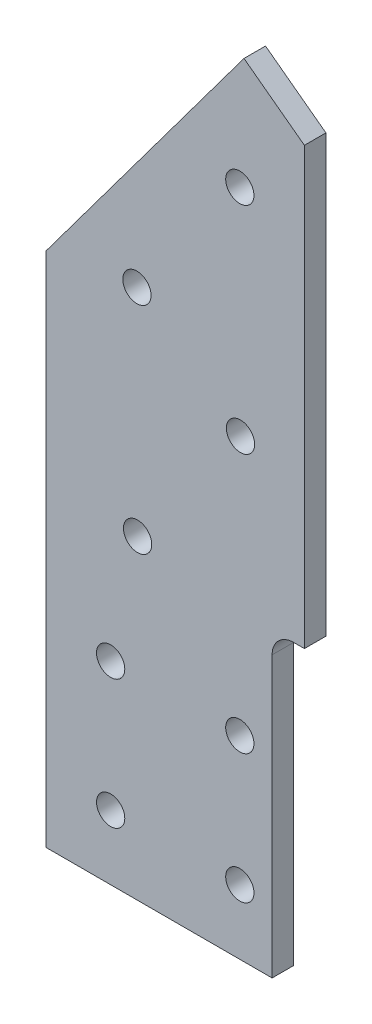
ISO-10303-21;
HEADER;
FILE_DESCRIPTION(('STEP AP214'),'2;1');
FILE_NAME('part.step','',(''),(''),'','','');
FILE_SCHEMA(('AUTOMOTIVE_DESIGN { 1 0 10303 214 1 1 1 1 }'));
ENDSEC;
DATA;
#1=APPLICATION_CONTEXT('core data for automotive mechanical design processes');
#2=APPLICATION_PROTOCOL_DEFINITION('international standard','automotive_design',2000,#1);
#3=PRODUCT_CONTEXT('',#1,'mechanical');
#4=PRODUCT('Part','Part','',(#3));
#5=PRODUCT_RELATED_PRODUCT_CATEGORY('part','',(#4));
#6=PRODUCT_DEFINITION_FORMATION('','',#4);
#7=PRODUCT_DEFINITION_CONTEXT('part definition',#1,'design');
#8=PRODUCT_DEFINITION('design','',#6,#7);
#9=PRODUCT_DEFINITION_SHAPE('','',#8);
#10=(LENGTH_UNIT() NAMED_UNIT(*) SI_UNIT(.MILLI.,.METRE.));
#11=(NAMED_UNIT(*) PLANE_ANGLE_UNIT() SI_UNIT($,.RADIAN.));
#12=(NAMED_UNIT(*) SI_UNIT($,.STERADIAN.) SOLID_ANGLE_UNIT());
#13=UNCERTAINTY_MEASURE_WITH_UNIT(LENGTH_MEASURE(1.E-05),#10,'distance_accuracy_value','');
#14=(GEOMETRIC_REPRESENTATION_CONTEXT(3) GLOBAL_UNCERTAINTY_ASSIGNED_CONTEXT((#13)) GLOBAL_UNIT_ASSIGNED_CONTEXT((#10,
#11,#12)) REPRESENTATION_CONTEXT('',''));
#15=CARTESIAN_POINT('',(0.,0.,0.));
#16=DIRECTION('',(0.,0.,1.));
#17=DIRECTION('',(1.,0.,0.));
#18=AXIS2_PLACEMENT_3D('',#15,#16,#17);
#19=CARTESIAN_POINT('',(0.,0.,0.));
#20=DIRECTION('',(0.,0.,-1.));
#21=DIRECTION('',(-1.,0.,0.));
#22=AXIS2_PLACEMENT_3D('',#19,#20,#21);
#23=PLANE('',#22);
#24=DIRECTION('',(-1.,0.,0.));
#25=VECTOR('',#24,1.);
#26=CARTESIAN_POINT('',(76.2,88.9,0.));
#27=LINE('',#26,#25);
#28=CARTESIAN_POINT('',(76.2,88.9000000000001,0.));
#29=VERTEX_POINT('',#28);
#30=CARTESIAN_POINT('',(73.025,88.9,0.));
#31=VERTEX_POINT('',#30);
#32=EDGE_CURVE('E114',#29,#31,#27,.T.);
#33=ORIENTED_EDGE('',*,*,#32,.T.);
#34=CARTESIAN_POINT('',(73.025,82.55,0.));
#35=DIRECTION('',(0.,0.,-1.));
#36=DIRECTION('',(-1.,0.,0.));
#37=AXIS2_PLACEMENT_3D('',#34,#35,#36);
#38=CIRCLE('',#37,6.35);
#39=CARTESIAN_POINT('',(66.675,82.55,0.));
#40=VERTEX_POINT('',#39);
#41=EDGE_CURVE('E11',#31,#40,#38,.F.);
#42=ORIENTED_EDGE('',*,*,#41,.T.);
#43=DIRECTION('',(0.,-1.,0.));
#44=VECTOR('',#43,1.);
#45=CARTESIAN_POINT('',(66.675,0.,0.));
#46=LINE('',#45,#44);
#47=CARTESIAN_POINT('',(66.675,0.,0.));
#48=VERTEX_POINT('',#47);
#49=EDGE_CURVE('E102',#40,#48,#46,.T.);
#50=ORIENTED_EDGE('',*,*,#49,.T.);
#51=DIRECTION('',(1.,0.,0.));
#52=VECTOR('',#51,1.);
#53=CARTESIAN_POINT('',(0.,0.,0.));
#54=LINE('',#53,#52);
#55=CARTESIAN_POINT('',(0.,0.,0.));
#56=VERTEX_POINT('',#55);
#57=EDGE_CURVE('E107',#56,#48,#54,.T.);
#58=ORIENTED_EDGE('',*,*,#57,.F.);
#59=DIRECTION('',(0.,-1.,0.));
#60=VECTOR('',#59,1.);
#61=CARTESIAN_POINT('',(0.,0.,0.));
#62=LINE('',#61,#60);
#63=CARTESIAN_POINT('',(0.,152.4,0.));
#64=VERTEX_POINT('',#63);
#65=EDGE_CURVE('E129',#64,#56,#62,.T.);
#66=ORIENTED_EDGE('',*,*,#65,.F.);
#67=DIRECTION('',(-0.597485201625335,-0.801879937296559,0.));
#68=VECTOR('',#67,1.);
#69=CARTESIAN_POINT('',(0.,152.4,0.));
#70=LINE('',#69,#68);
#71=CARTESIAN_POINT('',(58.378218393584,230.74892308226,0.));
#72=VERTEX_POINT('',#71);
#73=EDGE_CURVE('E138',#72,#64,#70,.T.);
#74=ORIENTED_EDGE('',*,*,#73,.F.);
#75=DIRECTION('',(-0.801879937296559,0.597485201625334,0.));
#76=VECTOR('',#75,1.);
#77=CARTESIAN_POINT('',(58.378218393584,230.74892308226,0.));
#78=LINE('',#77,#76);
#79=CARTESIAN_POINT('',(76.2,217.469814476137,0.));
#80=VERTEX_POINT('',#79);
#81=EDGE_CURVE('E131',#80,#72,#78,.T.);
#82=ORIENTED_EDGE('',*,*,#81,.F.);
#83=DIRECTION('',(0.,1.,0.));
#84=VECTOR('',#83,1.);
#85=CARTESIAN_POINT('',(76.2,217.469814476137,0.));
#86=LINE('',#85,#84);
#87=EDGE_CURVE('E128',#29,#80,#86,.T.);
#88=ORIENTED_EDGE('',*,*,#87,.F.);
#89=EDGE_LOOP('',(#33,#42,#50,#58,#66,#74,#82,#88));
#90=FACE_BOUND('',#89,.T.);
#91=CARTESIAN_POINT('',(19.05,57.15,0.));
#92=DIRECTION('',(0.,0.,1.));
#93=DIRECTION('',(1.,0.,0.));
#94=AXIS2_PLACEMENT_3D('',#91,#92,#93);
#95=CIRCLE('',#94,4.167251);
#96=CARTESIAN_POINT('',(23.217251,57.15,0.));
#97=VERTEX_POINT('',#96);
#98=EDGE_CURVE('E158',#97,#97,#95,.T.);
#99=ORIENTED_EDGE('',*,*,#98,.T.);
#100=EDGE_LOOP('',(#99));
#101=FACE_BOUND('',#100,.T.);
#102=CARTESIAN_POINT('',(57.15,57.15,0.));
#103=DIRECTION('',(0.,0.,1.));
#104=DIRECTION('',(1.,0.,0.));
#105=AXIS2_PLACEMENT_3D('',#102,#103,#104);
#106=CIRCLE('',#105,4.167251);
#107=CARTESIAN_POINT('',(61.317251,57.15,0.));
#108=VERTEX_POINT('',#107);
#109=EDGE_CURVE('E152',#108,#108,#106,.T.);
#110=ORIENTED_EDGE('',*,*,#109,.T.);
#111=EDGE_LOOP('',(#110));
#112=FACE_BOUND('',#111,.T.);
#113=CARTESIAN_POINT('',(57.15,19.05,0.));
#114=DIRECTION('',(0.,0.,1.));
#115=DIRECTION('',(1.,0.,0.));
#116=AXIS2_PLACEMENT_3D('',#113,#114,#115);
#117=CIRCLE('',#116,4.167251);
#118=CARTESIAN_POINT('',(61.317251,19.05,0.));
#119=VERTEX_POINT('',#118);
#120=EDGE_CURVE('E133',#119,#119,#117,.T.);
#121=ORIENTED_EDGE('',*,*,#120,.T.);
#122=EDGE_LOOP('',(#121));
#123=FACE_BOUND('',#122,.T.);
#124=CARTESIAN_POINT('',(19.05,19.05,0.));
#125=DIRECTION('',(0.,0.,1.));
#126=DIRECTION('',(1.,0.,0.));
#127=AXIS2_PLACEMENT_3D('',#124,#125,#126);
#128=CIRCLE('',#127,4.167251);
#129=CARTESIAN_POINT('',(23.217251,19.05,0.));
#130=VERTEX_POINT('',#129);
#131=EDGE_CURVE('E200',#130,#130,#128,.T.);
#132=ORIENTED_EDGE('',*,*,#131,.T.);
#133=EDGE_LOOP('',(#132));
#134=FACE_BOUND('',#133,.T.);
#135=CARTESIAN_POINT('',(57.15,197.216906500204,0.));
#136=DIRECTION('',(0.,0.,1.));
#137=DIRECTION('',(1.,0.,0.));
#138=AXIS2_PLACEMENT_3D('',#135,#136,#137);
#139=CIRCLE('',#138,4.167251);
#140=CARTESIAN_POINT('',(61.317251,197.216906500204,0.));
#141=VERTEX_POINT('',#140);
#142=EDGE_CURVE('E197',#141,#141,#139,.T.);
#143=ORIENTED_EDGE('',*,*,#142,.T.);
#144=EDGE_LOOP('',(#143));
#145=FACE_BOUND('',#144,.T.);
#146=CARTESIAN_POINT('',(26.797751757433,156.481405685539,0.));
#147=DIRECTION('',(0.,0.,1.));
#148=DIRECTION('',(1.,0.,0.));
#149=AXIS2_PLACEMENT_3D('',#146,#147,#148);
#150=CIRCLE('',#149,4.167251);
#151=CARTESIAN_POINT('',(30.965002757433,156.481405685539,0.));
#152=VERTEX_POINT('',#151);
#153=EDGE_CURVE('E191',#152,#152,#150,.T.);
#154=ORIENTED_EDGE('',*,*,#153,.T.);
#155=EDGE_LOOP('',(#154));
#156=FACE_BOUND('',#155,.T.);
#157=CARTESIAN_POINT('',(57.3493773684319,133.717219503614,0.));
#158=DIRECTION('',(0.,0.,1.));
#159=DIRECTION('',(1.,0.,0.));
#160=AXIS2_PLACEMENT_3D('',#157,#158,#159);
#161=CIRCLE('',#160,4.167251);
#162=CARTESIAN_POINT('',(61.5166283684319,133.717219503614,0.));
#163=VERTEX_POINT('',#162);
#164=EDGE_CURVE('E185',#163,#163,#161,.T.);
#165=ORIENTED_EDGE('',*,*,#164,.T.);
#166=EDGE_LOOP('',(#165));
#167=FACE_BOUND('',#166,.T.);
#168=CARTESIAN_POINT('',(26.9971291258649,92.9817186889487,0.));
#169=DIRECTION('',(0.,0.,1.));
#170=DIRECTION('',(1.,0.,0.));
#171=AXIS2_PLACEMENT_3D('',#168,#169,#170);
#172=CIRCLE('',#171,4.167251);
#173=CARTESIAN_POINT('',(31.1643801258649,92.9817186889487,0.));
#174=VERTEX_POINT('',#173);
#175=EDGE_CURVE('E179',#174,#174,#172,.T.);
#176=ORIENTED_EDGE('',*,*,#175,.T.);
#177=EDGE_LOOP('',(#176));
#178=FACE_BOUND('',#177,.T.);
#179=ADVANCED_FACE('F39',(#90,#101,#112,#123,#134,#145,#156,#167,#178),#23,.T.);
#180=CARTESIAN_POINT('',(0.,0.,6.35));
#181=DIRECTION('',(0.,0.,-1.));
#182=DIRECTION('',(-1.,0.,0.));
#183=AXIS2_PLACEMENT_3D('',#180,#181,#182);
#184=PLANE('',#183);
#185=CARTESIAN_POINT('',(26.9971291258649,92.9817186889487,6.35));
#186=DIRECTION('',(0.,0.,1.));
#187=DIRECTION('',(1.,0.,0.));
#188=AXIS2_PLACEMENT_3D('',#185,#186,#187);
#189=CIRCLE('',#188,4.167251);
#190=CARTESIAN_POINT('',(31.1643801258649,92.9817186889487,6.35));
#191=VERTEX_POINT('',#190);
#192=EDGE_CURVE('E122',#191,#191,#189,.T.);
#193=ORIENTED_EDGE('',*,*,#192,.F.);
#194=EDGE_LOOP('',(#193));
#195=FACE_BOUND('',#194,.T.);
#196=CARTESIAN_POINT('',(57.3493773684319,133.717219503614,6.35));
#197=DIRECTION('',(0.,0.,1.));
#198=DIRECTION('',(1.,0.,0.));
#199=AXIS2_PLACEMENT_3D('',#196,#197,#198);
#200=CIRCLE('',#199,4.167251);
#201=CARTESIAN_POINT('',(61.5166283684319,133.717219503614,6.35));
#202=VERTEX_POINT('',#201);
#203=EDGE_CURVE('E182',#202,#202,#200,.T.);
#204=ORIENTED_EDGE('',*,*,#203,.F.);
#205=EDGE_LOOP('',(#204));
#206=FACE_BOUND('',#205,.T.);
#207=CARTESIAN_POINT('',(57.15,197.216906500204,6.35));
#208=DIRECTION('',(0.,0.,1.));
#209=DIRECTION('',(1.,0.,0.));
#210=AXIS2_PLACEMENT_3D('',#207,#208,#209);
#211=CIRCLE('',#210,4.167251);
#212=CARTESIAN_POINT('',(61.317251,197.216906500204,6.35));
#213=VERTEX_POINT('',#212);
#214=EDGE_CURVE('E194',#213,#213,#211,.T.);
#215=ORIENTED_EDGE('',*,*,#214,.F.);
#216=EDGE_LOOP('',(#215));
#217=FACE_BOUND('',#216,.T.);
#218=CARTESIAN_POINT('',(19.05,19.05,6.35));
#219=DIRECTION('',(0.,0.,1.));
#220=DIRECTION('',(1.,0.,0.));
#221=AXIS2_PLACEMENT_3D('',#218,#219,#220);
#222=CIRCLE('',#221,4.167251);
#223=CARTESIAN_POINT('',(23.217251,19.05,6.35));
#224=VERTEX_POINT('',#223);
#225=EDGE_CURVE('E203',#224,#224,#222,.T.);
#226=ORIENTED_EDGE('',*,*,#225,.F.);
#227=EDGE_LOOP('',(#226));
#228=FACE_BOUND('',#227,.T.);
#229=CARTESIAN_POINT('',(57.15,19.05,6.35));
#230=DIRECTION('',(0.,0.,1.));
#231=DIRECTION('',(1.,0.,0.));
#232=AXIS2_PLACEMENT_3D('',#229,#230,#231);
#233=CIRCLE('',#232,4.167251);
#234=CARTESIAN_POINT('',(61.317251,19.05,6.35));
#235=VERTEX_POINT('',#234);
#236=EDGE_CURVE('E206',#235,#235,#233,.T.);
#237=ORIENTED_EDGE('',*,*,#236,.F.);
#238=EDGE_LOOP('',(#237));
#239=FACE_BOUND('',#238,.T.);
#240=DIRECTION('',(1.,0.,0.));
#241=VECTOR('',#240,1.);
#242=CARTESIAN_POINT('',(0.,0.,6.35));
#243=LINE('',#242,#241);
#244=CARTESIAN_POINT('',(0.,0.,6.35));
#245=VERTEX_POINT('',#244);
#246=CARTESIAN_POINT('',(66.675,0.,6.35));
#247=VERTEX_POINT('',#246);
#248=EDGE_CURVE('E170',#245,#247,#243,.T.);
#249=ORIENTED_EDGE('',*,*,#248,.T.);
#250=DIRECTION('',(0.,-1.,0.));
#251=VECTOR('',#250,1.);
#252=CARTESIAN_POINT('',(66.675,0.,6.35));
#253=LINE('',#252,#251);
#254=CARTESIAN_POINT('',(66.675,82.55,6.35));
#255=VERTEX_POINT('',#254);
#256=EDGE_CURVE('E119',#255,#247,#253,.T.);
#257=ORIENTED_EDGE('',*,*,#256,.F.);
#258=CARTESIAN_POINT('',(73.025,82.55,6.35));
#259=DIRECTION('',(0.,0.,-1.));
#260=DIRECTION('',(-1.,0.,0.));
#261=AXIS2_PLACEMENT_3D('',#258,#259,#260);
#262=CIRCLE('',#261,6.35);
#263=CARTESIAN_POINT('',(73.025,88.9,6.35));
#264=VERTEX_POINT('',#263);
#265=EDGE_CURVE('E47',#255,#264,#262,.T.);
#266=ORIENTED_EDGE('',*,*,#265,.T.);
#267=DIRECTION('',(-1.,0.,0.));
#268=VECTOR('',#267,1.);
#269=CARTESIAN_POINT('',(76.2,88.9,6.35));
#270=LINE('',#269,#268);
#271=CARTESIAN_POINT('',(76.2,88.9,6.35));
#272=VERTEX_POINT('',#271);
#273=EDGE_CURVE('E171',#272,#264,#270,.T.);
#274=ORIENTED_EDGE('',*,*,#273,.F.);
#275=DIRECTION('',(0.,1.,0.));
#276=VECTOR('',#275,1.);
#277=CARTESIAN_POINT('',(76.2,217.469814476137,6.35));
#278=LINE('',#277,#276);
#279=CARTESIAN_POINT('',(76.2,217.469814476137,6.35));
#280=VERTEX_POINT('',#279);
#281=EDGE_CURVE('E213',#272,#280,#278,.T.);
#282=ORIENTED_EDGE('',*,*,#281,.T.);
#283=DIRECTION('',(-0.801879937296559,0.597485201625334,0.));
#284=VECTOR('',#283,1.);
#285=CARTESIAN_POINT('',(58.378218393584,230.74892308226,6.35));
#286=LINE('',#285,#284);
#287=CARTESIAN_POINT('',(58.378218393584,230.74892308226,6.35));
#288=VERTEX_POINT('',#287);
#289=EDGE_CURVE('E215',#280,#288,#286,.T.);
#290=ORIENTED_EDGE('',*,*,#289,.T.);
#291=DIRECTION('',(-0.597485201625335,-0.801879937296559,0.));
#292=VECTOR('',#291,1.);
#293=CARTESIAN_POINT('',(0.,152.4,6.35));
#294=LINE('',#293,#292);
#295=CARTESIAN_POINT('',(0.,152.4,6.35));
#296=VERTEX_POINT('',#295);
#297=EDGE_CURVE('E145',#288,#296,#294,.T.);
#298=ORIENTED_EDGE('',*,*,#297,.T.);
#299=DIRECTION('',(0.,-1.,0.));
#300=VECTOR('',#299,1.);
#301=CARTESIAN_POINT('',(0.,0.,6.35));
#302=LINE('',#301,#300);
#303=EDGE_CURVE('E140',#296,#245,#302,.T.);
#304=ORIENTED_EDGE('',*,*,#303,.T.);
#305=EDGE_LOOP('',(#249,#257,#266,#274,#282,#290,#298,#304));
#306=FACE_BOUND('',#305,.T.);
#307=CARTESIAN_POINT('',(57.15,57.15,6.35));
#308=DIRECTION('',(0.,0.,1.));
#309=DIRECTION('',(1.,0.,0.));
#310=AXIS2_PLACEMENT_3D('',#307,#308,#309);
#311=CIRCLE('',#310,4.167251);
#312=CARTESIAN_POINT('',(61.317251,57.15,6.35));
#313=VERTEX_POINT('',#312);
#314=EDGE_CURVE('E155',#313,#313,#311,.T.);
#315=ORIENTED_EDGE('',*,*,#314,.F.);
#316=EDGE_LOOP('',(#315));
#317=FACE_BOUND('',#316,.T.);
#318=CARTESIAN_POINT('',(19.05,57.15,6.35));
#319=DIRECTION('',(0.,0.,1.));
#320=DIRECTION('',(1.,0.,0.));
#321=AXIS2_PLACEMENT_3D('',#318,#319,#320);
#322=CIRCLE('',#321,4.167251);
#323=CARTESIAN_POINT('',(23.217251,57.15,6.35));
#324=VERTEX_POINT('',#323);
#325=EDGE_CURVE('E161',#324,#324,#322,.T.);
#326=ORIENTED_EDGE('',*,*,#325,.F.);
#327=EDGE_LOOP('',(#326));
#328=FACE_BOUND('',#327,.T.);
#329=CARTESIAN_POINT('',(26.797751757433,156.481405685539,6.35));
#330=DIRECTION('',(0.,0.,1.));
#331=DIRECTION('',(1.,0.,0.));
#332=AXIS2_PLACEMENT_3D('',#329,#330,#331);
#333=CIRCLE('',#332,4.167251);
#334=CARTESIAN_POINT('',(30.965002757433,156.481405685539,6.35));
#335=VERTEX_POINT('',#334);
#336=EDGE_CURVE('E188',#335,#335,#333,.T.);
#337=ORIENTED_EDGE('',*,*,#336,.F.);
#338=EDGE_LOOP('',(#337));
#339=FACE_BOUND('',#338,.T.);
#340=ADVANCED_FACE('F167',(#195,#206,#217,#228,#239,#306,#317,#328,#339),#184,.F.);
#341=CARTESIAN_POINT('',(19.05,57.15,6.35));
#342=DIRECTION('',(0.,0.,1.));
#343=DIRECTION('',(1.,0.,0.));
#344=AXIS2_PLACEMENT_3D('',#341,#342,#343);
#345=CYLINDRICAL_SURFACE('',#344,4.167251);
#346=ORIENTED_EDGE('',*,*,#98,.F.);
#347=EDGE_LOOP('',(#346));
#348=FACE_BOUND('',#347,.T.);
#349=ORIENTED_EDGE('',*,*,#325,.T.);
#350=EDGE_LOOP('',(#349));
#351=FACE_BOUND('',#350,.T.);
#352=ADVANCED_FACE('F247',(#348,#351),#345,.F.);
#353=CARTESIAN_POINT('',(57.15,57.15,6.35));
#354=DIRECTION('',(0.,0.,1.));
#355=DIRECTION('',(1.,0.,0.));
#356=AXIS2_PLACEMENT_3D('',#353,#354,#355);
#357=CYLINDRICAL_SURFACE('',#356,4.167251);
#358=ORIENTED_EDGE('',*,*,#109,.F.);
#359=EDGE_LOOP('',(#358));
#360=FACE_BOUND('',#359,.T.);
#361=ORIENTED_EDGE('',*,*,#314,.T.);
#362=EDGE_LOOP('',(#361));
#363=FACE_BOUND('',#362,.T.);
#364=ADVANCED_FACE('F262',(#360,#363),#357,.F.);
#365=CARTESIAN_POINT('',(0.,0.,6.35));
#366=DIRECTION('',(1.,0.,0.));
#367=DIRECTION('',(0.,0.,-1.));
#368=AXIS2_PLACEMENT_3D('',#365,#366,#367);
#369=PLANE('',#368);
#370=ORIENTED_EDGE('',*,*,#65,.T.);
#371=DIRECTION('',(0.,0.,-1.));
#372=VECTOR('',#371,1.);
#373=CARTESIAN_POINT('',(0.,0.,6.35));
#374=LINE('',#373,#372);
#375=EDGE_CURVE('E126',#245,#56,#374,.T.);
#376=ORIENTED_EDGE('',*,*,#375,.F.);
#377=ORIENTED_EDGE('',*,*,#303,.F.);
#378=DIRECTION('',(0.,0.,-1.));
#379=VECTOR('',#378,1.);
#380=CARTESIAN_POINT('',(0.,152.4,6.35));
#381=LINE('',#380,#379);
#382=EDGE_CURVE('E141',#296,#64,#381,.T.);
#383=ORIENTED_EDGE('',*,*,#382,.T.);
#384=EDGE_LOOP('',(#370,#376,#377,#383));
#385=FACE_BOUND('',#384,.T.);
#386=ADVANCED_FACE('F225',(#385),#369,.F.);
#387=CARTESIAN_POINT('',(0.,0.,6.35));
#388=DIRECTION('',(0.,1.,0.));
#389=DIRECTION('',(0.,0.,1.));
#390=AXIS2_PLACEMENT_3D('',#387,#388,#389);
#391=PLANE('',#390);
#392=ORIENTED_EDGE('',*,*,#57,.T.);
#393=DIRECTION('',(0.,0.,1.));
#394=VECTOR('',#393,1.);
#395=CARTESIAN_POINT('',(66.675,0.,0.));
#396=LINE('',#395,#394);
#397=EDGE_CURVE('E117',#48,#247,#396,.T.);
#398=ORIENTED_EDGE('',*,*,#397,.T.);
#399=ORIENTED_EDGE('',*,*,#248,.F.);
#400=ORIENTED_EDGE('',*,*,#375,.T.);
#401=EDGE_LOOP('',(#392,#398,#399,#400));
#402=FACE_BOUND('',#401,.T.);
#403=ADVANCED_FACE('F124',(#402),#391,.F.);
#404=CARTESIAN_POINT('',(76.2,217.469814476137,6.35));
#405=DIRECTION('',(-1.,0.,0.));
#406=DIRECTION('',(0.,-1.,0.));
#407=AXIS2_PLACEMENT_3D('',#404,#405,#406);
#408=PLANE('',#407);
#409=ORIENTED_EDGE('',*,*,#281,.F.);
#410=DIRECTION('',(0.,0.,1.));
#411=VECTOR('',#410,1.);
#412=CARTESIAN_POINT('',(76.2,88.9,0.));
#413=LINE('',#412,#411);
#414=EDGE_CURVE('E113',#29,#272,#413,.T.);
#415=ORIENTED_EDGE('',*,*,#414,.F.);
#416=ORIENTED_EDGE('',*,*,#87,.T.);
#417=DIRECTION('',(0.,0.,-1.));
#418=VECTOR('',#417,1.);
#419=CARTESIAN_POINT('',(76.2,217.469814476137,6.35));
#420=LINE('',#419,#418);
#421=EDGE_CURVE('E148',#280,#80,#420,.T.);
#422=ORIENTED_EDGE('',*,*,#421,.F.);
#423=EDGE_LOOP('',(#409,#415,#416,#422));
#424=FACE_BOUND('',#423,.T.);
#425=ADVANCED_FACE('F233',(#424),#408,.F.);
#426=CARTESIAN_POINT('',(58.378218393584,230.74892308226,6.35));
#427=DIRECTION('',(-0.597485201625334,-0.801879937296559,0.));
#428=DIRECTION('',(0.801879937296559,-0.597485201625334,0.));
#429=AXIS2_PLACEMENT_3D('',#426,#427,#428);
#430=PLANE('',#429);
#431=ORIENTED_EDGE('',*,*,#81,.T.);
#432=DIRECTION('',(0.,0.,-1.));
#433=VECTOR('',#432,1.);
#434=CARTESIAN_POINT('',(58.378218393584,230.74892308226,6.35));
#435=LINE('',#434,#433);
#436=EDGE_CURVE('E144',#288,#72,#435,.T.);
#437=ORIENTED_EDGE('',*,*,#436,.F.);
#438=ORIENTED_EDGE('',*,*,#289,.F.);
#439=ORIENTED_EDGE('',*,*,#421,.T.);
#440=EDGE_LOOP('',(#431,#437,#438,#439));
#441=FACE_BOUND('',#440,.T.);
#442=ADVANCED_FACE('F229',(#441),#430,.F.);
#443=CARTESIAN_POINT('',(0.,152.4,6.35));
#444=DIRECTION('',(0.801879937296559,-0.597485201625335,0.));
#445=DIRECTION('',(0.597485201625335,0.801879937296559,0.));
#446=AXIS2_PLACEMENT_3D('',#443,#444,#445);
#447=PLANE('',#446);
#448=ORIENTED_EDGE('',*,*,#73,.T.);
#449=ORIENTED_EDGE('',*,*,#382,.F.);
#450=ORIENTED_EDGE('',*,*,#297,.F.);
#451=ORIENTED_EDGE('',*,*,#436,.T.);
#452=EDGE_LOOP('',(#448,#449,#450,#451));
#453=FACE_BOUND('',#452,.T.);
#454=ADVANCED_FACE('F222',(#453),#447,.F.);
#455=CARTESIAN_POINT('',(57.15,19.05,6.35));
#456=DIRECTION('',(0.,0.,1.));
#457=DIRECTION('',(1.,0.,0.));
#458=AXIS2_PLACEMENT_3D('',#455,#456,#457);
#459=CYLINDRICAL_SURFACE('',#458,4.167251);
#460=ORIENTED_EDGE('',*,*,#120,.F.);
#461=EDGE_LOOP('',(#460));
#462=FACE_BOUND('',#461,.T.);
#463=ORIENTED_EDGE('',*,*,#236,.T.);
#464=EDGE_LOOP('',(#463));
#465=FACE_BOUND('',#464,.T.);
#466=ADVANCED_FACE('F254',(#462,#465),#459,.F.);
#467=CARTESIAN_POINT('',(19.05,19.05,6.35));
#468=DIRECTION('',(0.,0.,1.));
#469=DIRECTION('',(1.,0.,0.));
#470=AXIS2_PLACEMENT_3D('',#467,#468,#469);
#471=CYLINDRICAL_SURFACE('',#470,4.167251);
#472=ORIENTED_EDGE('',*,*,#131,.F.);
#473=EDGE_LOOP('',(#472));
#474=FACE_BOUND('',#473,.T.);
#475=ORIENTED_EDGE('',*,*,#225,.T.);
#476=EDGE_LOOP('',(#475));
#477=FACE_BOUND('',#476,.T.);
#478=ADVANCED_FACE('F290',(#474,#477),#471,.F.);
#479=CARTESIAN_POINT('',(57.15,197.216906500204,6.35));
#480=DIRECTION('',(0.,0.,1.));
#481=DIRECTION('',(1.,0.,0.));
#482=AXIS2_PLACEMENT_3D('',#479,#480,#481);
#483=CYLINDRICAL_SURFACE('',#482,4.167251);
#484=ORIENTED_EDGE('',*,*,#142,.F.);
#485=EDGE_LOOP('',(#484));
#486=FACE_BOUND('',#485,.T.);
#487=ORIENTED_EDGE('',*,*,#214,.T.);
#488=EDGE_LOOP('',(#487));
#489=FACE_BOUND('',#488,.T.);
#490=ADVANCED_FACE('F280',(#486,#489),#483,.F.);
#491=CARTESIAN_POINT('',(26.797751757433,156.481405685539,6.35));
#492=DIRECTION('',(0.,0.,1.));
#493=DIRECTION('',(1.,0.,0.));
#494=AXIS2_PLACEMENT_3D('',#491,#492,#493);
#495=CYLINDRICAL_SURFACE('',#494,4.167251);
#496=ORIENTED_EDGE('',*,*,#153,.F.);
#497=EDGE_LOOP('',(#496));
#498=FACE_BOUND('',#497,.T.);
#499=ORIENTED_EDGE('',*,*,#336,.T.);
#500=EDGE_LOOP('',(#499));
#501=FACE_BOUND('',#500,.T.);
#502=ADVANCED_FACE('F277',(#498,#501),#495,.F.);
#503=CARTESIAN_POINT('',(57.3493773684319,133.717219503614,6.35));
#504=DIRECTION('',(0.,0.,1.));
#505=DIRECTION('',(1.,0.,0.));
#506=AXIS2_PLACEMENT_3D('',#503,#504,#505);
#507=CYLINDRICAL_SURFACE('',#506,4.167251);
#508=ORIENTED_EDGE('',*,*,#164,.F.);
#509=EDGE_LOOP('',(#508));
#510=FACE_BOUND('',#509,.T.);
#511=ORIENTED_EDGE('',*,*,#203,.T.);
#512=EDGE_LOOP('',(#511));
#513=FACE_BOUND('',#512,.T.);
#514=ADVANCED_FACE('F279',(#510,#513),#507,.F.);
#515=CARTESIAN_POINT('',(26.9971291258649,92.9817186889487,6.35));
#516=DIRECTION('',(0.,0.,1.));
#517=DIRECTION('',(1.,0.,0.));
#518=AXIS2_PLACEMENT_3D('',#515,#516,#517);
#519=CYLINDRICAL_SURFACE('',#518,4.167251);
#520=ORIENTED_EDGE('',*,*,#175,.F.);
#521=EDGE_LOOP('',(#520));
#522=FACE_BOUND('',#521,.T.);
#523=ORIENTED_EDGE('',*,*,#192,.T.);
#524=EDGE_LOOP('',(#523));
#525=FACE_BOUND('',#524,.T.);
#526=ADVANCED_FACE('F287',(#522,#525),#519,.F.);
#527=CARTESIAN_POINT('',(66.675,0.,0.));
#528=DIRECTION('',(-1.,0.,0.));
#529=DIRECTION('',(0.,0.,1.));
#530=AXIS2_PLACEMENT_3D('',#527,#528,#529);
#531=PLANE('',#530);
#532=ORIENTED_EDGE('',*,*,#49,.F.);
#533=DIRECTION('',(0.,0.,1.));
#534=VECTOR('',#533,1.);
#535=CARTESIAN_POINT('',(66.675,82.55,6.35));
#536=LINE('',#535,#534);
#537=EDGE_CURVE('E164',#40,#255,#536,.T.);
#538=ORIENTED_EDGE('',*,*,#537,.T.);
#539=ORIENTED_EDGE('',*,*,#256,.T.);
#540=ORIENTED_EDGE('',*,*,#397,.F.);
#541=EDGE_LOOP('',(#532,#538,#539,#540));
#542=FACE_BOUND('',#541,.T.);
#543=ADVANCED_FACE('F118',(#542),#531,.F.);
#544=CARTESIAN_POINT('',(76.2,88.9,0.));
#545=DIRECTION('',(0.,1.,0.));
#546=DIRECTION('',(0.,0.,1.));
#547=AXIS2_PLACEMENT_3D('',#544,#545,#546);
#548=PLANE('',#547);
#549=ORIENTED_EDGE('',*,*,#273,.T.);
#550=DIRECTION('',(0.,0.,1.));
#551=VECTOR('',#550,1.);
#552=CARTESIAN_POINT('',(73.025,88.9,0.));
#553=LINE('',#552,#551);
#554=EDGE_CURVE('E54',#264,#31,#553,.F.);
#555=ORIENTED_EDGE('',*,*,#554,.T.);
#556=ORIENTED_EDGE('',*,*,#32,.F.);
#557=ORIENTED_EDGE('',*,*,#414,.T.);
#558=EDGE_LOOP('',(#549,#555,#556,#557));
#559=FACE_BOUND('',#558,.T.);
#560=ADVANCED_FACE('F235',(#559),#548,.F.);
#561=CARTESIAN_POINT('',(73.025,82.55,0.));
#562=DIRECTION('',(0.,0.,-1.));
#563=DIRECTION('',(-1.,0.,0.));
#564=AXIS2_PLACEMENT_3D('',#561,#562,#563);
#565=CYLINDRICAL_SURFACE('',#564,6.35);
#566=ORIENTED_EDGE('',*,*,#41,.F.);
#567=ORIENTED_EDGE('',*,*,#554,.F.);
#568=ORIENTED_EDGE('',*,*,#265,.F.);
#569=ORIENTED_EDGE('',*,*,#537,.F.);
#570=EDGE_LOOP('',(#566,#567,#568,#569));
#571=FACE_BOUND('',#570,.T.);
#572=ADVANCED_FACE('F41',(#571),#565,.F.);
#573=CLOSED_SHELL('',(#179,#340,#352,#364,#386,#403,#425,#442,#454,#466,#478,#490,#502,#514,
#526,#543,#560,#572));
#574=MANIFOLD_SOLID_BREP('B2',#573);
#575=ADVANCED_BREP_SHAPE_REPRESENTATION('',(#18,#574),#14);
#576=SHAPE_DEFINITION_REPRESENTATION(#9,#575);
ENDSEC;
END-ISO-10303-21;
